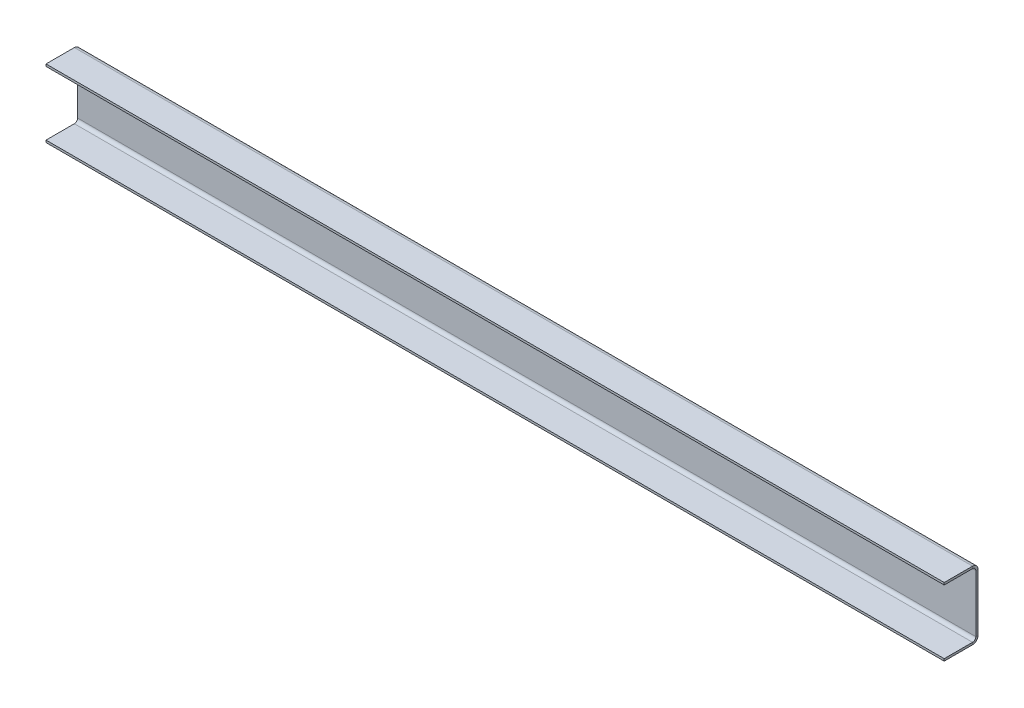
ISO-10303-21;
HEADER;
FILE_DESCRIPTION(('STEP AP214'),'2;1');
FILE_NAME('part.step','',(''),(''),'','','');
FILE_SCHEMA(('AUTOMOTIVE_DESIGN { 1 0 10303 214 1 1 1 1 }'));
ENDSEC;
DATA;
#1=APPLICATION_CONTEXT('core data for automotive mechanical design processes');
#2=APPLICATION_PROTOCOL_DEFINITION('international standard','automotive_design',2000,#1);
#3=PRODUCT_CONTEXT('',#1,'mechanical');
#4=PRODUCT('Part','Part','',(#3));
#5=PRODUCT_RELATED_PRODUCT_CATEGORY('part','',(#4));
#6=PRODUCT_DEFINITION_FORMATION('','',#4);
#7=PRODUCT_DEFINITION_CONTEXT('part definition',#1,'design');
#8=PRODUCT_DEFINITION('design','',#6,#7);
#9=PRODUCT_DEFINITION_SHAPE('','',#8);
#10=(LENGTH_UNIT() NAMED_UNIT(*) SI_UNIT(.MILLI.,.METRE.));
#11=(NAMED_UNIT(*) PLANE_ANGLE_UNIT() SI_UNIT($,.RADIAN.));
#12=(NAMED_UNIT(*) SI_UNIT($,.STERADIAN.) SOLID_ANGLE_UNIT());
#13=UNCERTAINTY_MEASURE_WITH_UNIT(LENGTH_MEASURE(1.E-05),#10,'distance_accuracy_value','');
#14=(GEOMETRIC_REPRESENTATION_CONTEXT(3) GLOBAL_UNCERTAINTY_ASSIGNED_CONTEXT((#13)) GLOBAL_UNIT_ASSIGNED_CONTEXT((#10,
#11,#12)) REPRESENTATION_CONTEXT('',''));
#15=CARTESIAN_POINT('',(0.,0.,0.));
#16=DIRECTION('',(0.,0.,1.));
#17=DIRECTION('',(1.,0.,0.));
#18=AXIS2_PLACEMENT_3D('',#15,#16,#17);
#19=CARTESIAN_POINT('',(0.,0.,-4.));
#20=DIRECTION('',(0.,0.,-1.));
#21=DIRECTION('',(-1.,0.,0.));
#22=AXIS2_PLACEMENT_3D('',#19,#20,#21);
#23=PLANE('',#22);
#24=DIRECTION('',(0.,1.,0.));
#25=VECTOR('',#24,1.);
#26=CARTESIAN_POINT('',(483.12769010043,106.886657101865,-4.));
#27=LINE('',#26,#25);
#28=CARTESIAN_POINT('',(483.12769010043,-8.11334289813497,-3.99999999999976));
#29=VERTEX_POINT('',#28);
#30=CARTESIAN_POINT('',(483.12769010043,96.8866571018649,-4.));
#31=VERTEX_POINT('',#30);
#32=EDGE_CURVE('E90',#29,#31,#27,.T.);
#33=ORIENTED_EDGE('',*,*,#32,.F.);
#34=DIRECTION('',(1.,0.,0.));
#35=VECTOR('',#34,1.);
#36=CARTESIAN_POINT('',(483.12769010043,-8.11334289813497,-3.99999999999976));
#37=LINE('',#36,#35);
#38=CARTESIAN_POINT('',(-1164.87230989957,-8.11334289813533,-4.));
#39=VERTEX_POINT('',#38);
#40=EDGE_CURVE('E280',#29,#39,#37,.F.);
#41=ORIENTED_EDGE('',*,*,#40,.T.);
#42=DIRECTION('',(0.,-1.,0.));
#43=VECTOR('',#42,1.);
#44=CARTESIAN_POINT('',(-1164.87230989957,106.886657101865,-4.));
#45=LINE('',#44,#43);
#46=CARTESIAN_POINT('',(-1164.87230989957,96.8866571018649,-4.00000000000002));
#47=VERTEX_POINT('',#46);
#48=EDGE_CURVE('E13',#47,#39,#45,.T.);
#49=ORIENTED_EDGE('',*,*,#48,.F.);
#50=DIRECTION('',(-1.,0.,0.));
#51=VECTOR('',#50,1.);
#52=CARTESIAN_POINT('',(-1164.87230989957,96.8866571018649,-4.00000000000002));
#53=LINE('',#52,#51);
#54=EDGE_CURVE('E105',#47,#31,#53,.F.);
#55=ORIENTED_EDGE('',*,*,#54,.T.);
#56=EDGE_LOOP('',(#33,#41,#49,#55));
#57=FACE_BOUND('',#56,.T.);
#58=ADVANCED_FACE('F81',(#57),#23,.T.);
#59=CARTESIAN_POINT('',(0.,0.,0.));
#60=DIRECTION('',(0.,0.,-1.));
#61=DIRECTION('',(-1.,0.,0.));
#62=AXIS2_PLACEMENT_3D('',#59,#60,#61);
#63=PLANE('',#62);
#64=DIRECTION('',(1.,0.,0.));
#65=VECTOR('',#64,1.);
#66=CARTESIAN_POINT('',(483.12769010043,-8.11334289813488,2.36789754470834E-13));
#67=LINE('',#66,#65);
#68=CARTESIAN_POINT('',(483.12769010043,-8.11334289813488,2.36789754470834E-13));
#69=VERTEX_POINT('',#68);
#70=CARTESIAN_POINT('',(-1164.87230989957,-8.11334289813536,1.17961196366423E-13));
#71=VERTEX_POINT('',#70);
#72=EDGE_CURVE('E197',#69,#71,#67,.F.);
#73=ORIENTED_EDGE('',*,*,#72,.F.);
#74=DIRECTION('',(0.,1.,0.));
#75=VECTOR('',#74,1.);
#76=CARTESIAN_POINT('',(483.12769010043,106.886657101865,0.));
#77=LINE('',#76,#75);
#78=CARTESIAN_POINT('',(483.12769010043,96.8866571018649,-1.37043154602168E-13));
#79=VERTEX_POINT('',#78);
#80=EDGE_CURVE('E186',#69,#79,#77,.T.);
#81=ORIENTED_EDGE('',*,*,#80,.T.);
#82=DIRECTION('',(-1.,0.,0.));
#83=VECTOR('',#82,1.);
#84=CARTESIAN_POINT('',(-1164.87230989957,96.8866571018649,0.));
#85=LINE('',#84,#83);
#86=CARTESIAN_POINT('',(-1164.87230989957,96.8866571018649,0.));
#87=VERTEX_POINT('',#86);
#88=EDGE_CURVE('E148',#87,#79,#85,.F.);
#89=ORIENTED_EDGE('',*,*,#88,.F.);
#90=DIRECTION('',(0.,-1.,0.));
#91=VECTOR('',#90,1.);
#92=CARTESIAN_POINT('',(-1164.87230989957,106.886657101865,0.));
#93=LINE('',#92,#91);
#94=EDGE_CURVE('E85',#87,#71,#93,.T.);
#95=ORIENTED_EDGE('',*,*,#94,.T.);
#96=EDGE_LOOP('',(#73,#81,#89,#95));
#97=FACE_BOUND('',#96,.T.);
#98=ADVANCED_FACE('F194',(#97),#63,.F.);
#99=CARTESIAN_POINT('',(483.12769010043,106.886657101865,-4.));
#100=DIRECTION('',(1.,0.,0.));
#101=DIRECTION('',(0.,0.,-1.));
#102=AXIS2_PLACEMENT_3D('',#99,#100,#101);
#103=PLANE('',#102);
#104=ORIENTED_EDGE('',*,*,#80,.F.);
#105=DIRECTION('',(0.,0.,-1.));
#106=VECTOR('',#105,1.);
#107=CARTESIAN_POINT('',(483.12769010043,-8.11334289813488,2.36789754470834E-13));
#108=LINE('',#107,#106);
#109=EDGE_CURVE('E210',#69,#29,#108,.T.);
#110=ORIENTED_EDGE('',*,*,#109,.T.);
#111=ORIENTED_EDGE('',*,*,#32,.T.);
#112=DIRECTION('',(0.,0.,-1.));
#113=VECTOR('',#112,1.);
#114=CARTESIAN_POINT('',(483.12769010043,96.8866571018649,-1.37043154602168E-13));
#115=LINE('',#114,#113);
#116=EDGE_CURVE('E183',#79,#31,#115,.T.);
#117=ORIENTED_EDGE('',*,*,#116,.F.);
#118=EDGE_LOOP('',(#104,#110,#111,#117));
#119=FACE_BOUND('',#118,.T.);
#120=ADVANCED_FACE('F83',(#119),#103,.T.);
#121=CARTESIAN_POINT('',(-1164.87230989957,106.886657101865,-4.));
#122=DIRECTION('',(-1.,0.,0.));
#123=DIRECTION('',(0.,0.,1.));
#124=AXIS2_PLACEMENT_3D('',#121,#122,#123);
#125=PLANE('',#124);
#126=DIRECTION('',(0.,0.,-1.));
#127=VECTOR('',#126,1.);
#128=CARTESIAN_POINT('',(-1164.87230989957,-8.11334289813536,1.17961196366423E-13));
#129=LINE('',#128,#127);
#130=EDGE_CURVE('E174',#71,#39,#129,.T.);
#131=ORIENTED_EDGE('',*,*,#130,.F.);
#132=ORIENTED_EDGE('',*,*,#94,.F.);
#133=DIRECTION('',(0.,0.,-1.));
#134=VECTOR('',#133,1.);
#135=CARTESIAN_POINT('',(-1164.87230989957,96.8866571018649,0.));
#136=LINE('',#135,#134);
#137=EDGE_CURVE('E147',#87,#47,#136,.T.);
#138=ORIENTED_EDGE('',*,*,#137,.T.);
#139=ORIENTED_EDGE('',*,*,#48,.T.);
#140=EDGE_LOOP('',(#131,#132,#138,#139));
#141=FACE_BOUND('',#140,.T.);
#142=ADVANCED_FACE('F202',(#141),#125,.T.);
#143=CARTESIAN_POINT('',(483.12769010043,96.886657101865,5.99999999999998));
#144=DIRECTION('',(1.,0.,0.));
#145=DIRECTION('',(0.,0.,-1.));
#146=AXIS2_PLACEMENT_3D('',#143,#144,#145);
#147=PLANE('',#146);
#148=DIRECTION('',(0.,1.,0.));
#149=VECTOR('',#148,1.);
#150=CARTESIAN_POINT('',(483.12769010043,106.886657101865,5.99999999999996));
#151=LINE('',#150,#149);
#152=CARTESIAN_POINT('',(483.12769010043,102.886657101865,5.99999999999996));
#153=VERTEX_POINT('',#152);
#154=CARTESIAN_POINT('',(483.12769010043,106.886657101865,5.99999999999995));
#155=VERTEX_POINT('',#154);
#156=EDGE_CURVE('E139',#153,#155,#151,.T.);
#157=ORIENTED_EDGE('',*,*,#156,.F.);
#158=CARTESIAN_POINT('',(483.12769010043,96.886657101865,5.99999999999998));
#159=DIRECTION('',(-1.,0.,0.));
#160=DIRECTION('',(0.,0.,1.));
#161=AXIS2_PLACEMENT_3D('',#158,#159,#160);
#162=CIRCLE('',#161,6.00000000000012);
#163=EDGE_CURVE('E133',#79,#153,#162,.F.);
#164=ORIENTED_EDGE('',*,*,#163,.F.);
#165=ORIENTED_EDGE('',*,*,#116,.T.);
#166=CARTESIAN_POINT('',(483.12769010043,96.886657101865,5.99999999999998));
#167=DIRECTION('',(-1.,0.,0.));
#168=DIRECTION('',(0.,0.,1.));
#169=AXIS2_PLACEMENT_3D('',#166,#167,#168);
#170=CIRCLE('',#169,10.0000000000001);
#171=EDGE_CURVE('E176',#31,#155,#170,.F.);
#172=ORIENTED_EDGE('',*,*,#171,.T.);
#173=EDGE_LOOP('',(#157,#164,#165,#172));
#174=FACE_BOUND('',#173,.T.);
#175=ADVANCED_FACE('F361',(#174),#147,.T.);
#176=CARTESIAN_POINT('',(-1164.87230989957,96.886657101865,6.0000000000001));
#177=DIRECTION('',(1.,0.,0.));
#178=DIRECTION('',(0.,0.,-1.));
#179=AXIS2_PLACEMENT_3D('',#176,#177,#178);
#180=PLANE('',#179);
#181=CARTESIAN_POINT('',(-1164.87230989957,96.886657101865,6.0000000000001));
#182=DIRECTION('',(-1.,0.,0.));
#183=DIRECTION('',(0.,0.,1.));
#184=AXIS2_PLACEMENT_3D('',#181,#182,#183);
#185=CIRCLE('',#184,6.00000000000012);
#186=CARTESIAN_POINT('',(-1164.87230989957,102.886657101865,6.00000000000008));
#187=VERTEX_POINT('',#186);
#188=EDGE_CURVE('E130',#187,#87,#185,.T.);
#189=ORIENTED_EDGE('',*,*,#188,.F.);
#190=DIRECTION('',(0.,1.,0.));
#191=VECTOR('',#190,1.);
#192=CARTESIAN_POINT('',(-1164.87230989957,102.886657101865,6.00000000000006));
#193=LINE('',#192,#191);
#194=CARTESIAN_POINT('',(-1164.87230989957,106.886657101865,6.00000000000005));
#195=VERTEX_POINT('',#194);
#196=EDGE_CURVE('E138',#187,#195,#193,.T.);
#197=ORIENTED_EDGE('',*,*,#196,.T.);
#198=CARTESIAN_POINT('',(-1164.87230989957,96.886657101865,6.0000000000001));
#199=DIRECTION('',(-1.,0.,0.));
#200=DIRECTION('',(0.,0.,1.));
#201=AXIS2_PLACEMENT_3D('',#198,#199,#200);
#202=CIRCLE('',#201,10.0000000000001);
#203=EDGE_CURVE('E177',#195,#47,#202,.T.);
#204=ORIENTED_EDGE('',*,*,#203,.T.);
#205=ORIENTED_EDGE('',*,*,#137,.F.);
#206=EDGE_LOOP('',(#189,#197,#204,#205));
#207=FACE_BOUND('',#206,.T.);
#208=ADVANCED_FACE('F143',(#207),#180,.F.);
#209=CARTESIAN_POINT('',(-1164.87230989957,96.886657101865,6.0000000000001));
#210=DIRECTION('',(-1.,0.,0.));
#211=DIRECTION('',(0.,1.,0.));
#212=AXIS2_PLACEMENT_3D('',#209,#210,#211);
#213=CYLINDRICAL_SURFACE('',#212,10.0000000000001);
#214=ORIENTED_EDGE('',*,*,#54,.F.);
#215=ORIENTED_EDGE('',*,*,#203,.F.);
#216=DIRECTION('',(-1.,0.,0.));
#217=VECTOR('',#216,1.);
#218=CARTESIAN_POINT('',(0.,106.886657101865,5.99999999999999));
#219=LINE('',#218,#217);
#220=EDGE_CURVE('E166',#155,#195,#219,.T.);
#221=ORIENTED_EDGE('',*,*,#220,.F.);
#222=ORIENTED_EDGE('',*,*,#171,.F.);
#223=EDGE_LOOP('',(#214,#215,#221,#222));
#224=FACE_BOUND('',#223,.T.);
#225=ADVANCED_FACE('F371',(#224),#213,.T.);
#226=CARTESIAN_POINT('',(-1164.87230989957,96.886657101865,6.0000000000001));
#227=DIRECTION('',(-1.,0.,0.));
#228=DIRECTION('',(0.,1.,0.));
#229=AXIS2_PLACEMENT_3D('',#226,#227,#228);
#230=CYLINDRICAL_SURFACE('',#229,6.00000000000012);
#231=ORIENTED_EDGE('',*,*,#88,.T.);
#232=ORIENTED_EDGE('',*,*,#163,.T.);
#233=DIRECTION('',(1.,0.,0.));
#234=VECTOR('',#233,1.);
#235=CARTESIAN_POINT('',(483.12769010043,102.886657101865,5.99999999999998));
#236=LINE('',#235,#234);
#237=EDGE_CURVE('E126',#153,#187,#236,.F.);
#238=ORIENTED_EDGE('',*,*,#237,.T.);
#239=ORIENTED_EDGE('',*,*,#188,.T.);
#240=EDGE_LOOP('',(#231,#232,#238,#239));
#241=FACE_BOUND('',#240,.T.);
#242=ADVANCED_FACE('F129',(#241),#230,.F.);
#243=CARTESIAN_POINT('',(-1164.87230989957,106.886657101865,0.));
#244=DIRECTION('',(-1.,0.,0.));
#245=DIRECTION('',(0.,-1.,0.));
#246=AXIS2_PLACEMENT_3D('',#243,#244,#245);
#247=PLANE('',#246);
#248=DIRECTION('',(0.,0.,-1.));
#249=VECTOR('',#248,1.);
#250=CARTESIAN_POINT('',(-1164.87230989957,106.886657101865,0.));
#251=LINE('',#250,#249);
#252=CARTESIAN_POINT('',(-1164.87230989957,106.886657101865,58.));
#253=VERTEX_POINT('',#252);
#254=EDGE_CURVE('E165',#253,#195,#251,.T.);
#255=ORIENTED_EDGE('',*,*,#254,.T.);
#256=ORIENTED_EDGE('',*,*,#196,.F.);
#257=DIRECTION('',(0.,0.,1.));
#258=VECTOR('',#257,1.);
#259=CARTESIAN_POINT('',(-1164.87230989957,102.886657101865,-3.58050083697384E-13));
#260=LINE('',#259,#258);
#261=CARTESIAN_POINT('',(-1164.87230989957,102.886657101865,58.));
#262=VERTEX_POINT('',#261);
#263=EDGE_CURVE('E153',#262,#187,#260,.F.);
#264=ORIENTED_EDGE('',*,*,#263,.F.);
#265=DIRECTION('',(0.,-1.,0.));
#266=VECTOR('',#265,1.);
#267=CARTESIAN_POINT('',(-1164.87230989957,106.886657101865,58.));
#268=LINE('',#267,#266);
#269=EDGE_CURVE('E149',#253,#262,#268,.T.);
#270=ORIENTED_EDGE('',*,*,#269,.F.);
#271=EDGE_LOOP('',(#255,#256,#264,#270));
#272=FACE_BOUND('',#271,.T.);
#273=ADVANCED_FACE('F163',(#272),#247,.T.);
#274=CARTESIAN_POINT('',(483.12769010043,106.886657101865,58.));
#275=DIRECTION('',(1.,0.,0.));
#276=DIRECTION('',(0.,1.,0.));
#277=AXIS2_PLACEMENT_3D('',#274,#275,#276);
#278=PLANE('',#277);
#279=DIRECTION('',(0.,0.,-1.));
#280=VECTOR('',#279,1.);
#281=CARTESIAN_POINT('',(483.12769010043,102.886657101865,-3.58050083697385E-13));
#282=LINE('',#281,#280);
#283=CARTESIAN_POINT('',(483.12769010043,102.886657101865,58.));
#284=VERTEX_POINT('',#283);
#285=EDGE_CURVE('E168',#153,#284,#282,.F.);
#286=ORIENTED_EDGE('',*,*,#285,.F.);
#287=ORIENTED_EDGE('',*,*,#156,.T.);
#288=DIRECTION('',(0.,0.,1.));
#289=VECTOR('',#288,1.);
#290=CARTESIAN_POINT('',(483.12769010043,106.886657101865,58.));
#291=LINE('',#290,#289);
#292=CARTESIAN_POINT('',(483.12769010043,106.886657101865,58.));
#293=VERTEX_POINT('',#292);
#294=EDGE_CURVE('E160',#155,#293,#291,.T.);
#295=ORIENTED_EDGE('',*,*,#294,.T.);
#296=DIRECTION('',(0.,-1.,0.));
#297=VECTOR('',#296,1.);
#298=CARTESIAN_POINT('',(483.12769010043,106.886657101865,58.));
#299=LINE('',#298,#297);
#300=EDGE_CURVE('E220',#293,#284,#299,.T.);
#301=ORIENTED_EDGE('',*,*,#300,.T.);
#302=EDGE_LOOP('',(#286,#287,#295,#301));
#303=FACE_BOUND('',#302,.T.);
#304=ADVANCED_FACE('F232',(#303),#278,.T.);
#305=CARTESIAN_POINT('',(0.,106.886657101865,-3.72016009052757E-13));
#306=DIRECTION('',(0.,1.,0.));
#307=DIRECTION('',(0.,0.,1.));
#308=AXIS2_PLACEMENT_3D('',#305,#306,#307);
#309=PLANE('',#308);
#310=ORIENTED_EDGE('',*,*,#294,.F.);
#311=ORIENTED_EDGE('',*,*,#220,.T.);
#312=ORIENTED_EDGE('',*,*,#254,.F.);
#313=DIRECTION('',(-1.,0.,0.));
#314=VECTOR('',#313,1.);
#315=CARTESIAN_POINT('',(-1164.87230989957,106.886657101865,58.));
#316=LINE('',#315,#314);
#317=EDGE_CURVE('E224',#293,#253,#316,.T.);
#318=ORIENTED_EDGE('',*,*,#317,.F.);
#319=EDGE_LOOP('',(#310,#311,#312,#318));
#320=FACE_BOUND('',#319,.T.);
#321=ADVANCED_FACE('F370',(#320),#309,.T.);
#322=CARTESIAN_POINT('',(0.,102.886657101865,-3.58050083697385E-13));
#323=DIRECTION('',(0.,1.,0.));
#324=DIRECTION('',(0.,0.,1.));
#325=AXIS2_PLACEMENT_3D('',#322,#323,#324);
#326=PLANE('',#325);
#327=ORIENTED_EDGE('',*,*,#237,.F.);
#328=ORIENTED_EDGE('',*,*,#285,.T.);
#329=DIRECTION('',(1.,0.,0.));
#330=VECTOR('',#329,1.);
#331=CARTESIAN_POINT('',(0.,102.886657101865,58.));
#332=LINE('',#331,#330);
#333=EDGE_CURVE('E157',#284,#262,#332,.F.);
#334=ORIENTED_EDGE('',*,*,#333,.T.);
#335=ORIENTED_EDGE('',*,*,#263,.T.);
#336=EDGE_LOOP('',(#327,#328,#334,#335));
#337=FACE_BOUND('',#336,.T.);
#338=ADVANCED_FACE('F154',(#337),#326,.F.);
#339=CARTESIAN_POINT('',(-1164.87230989957,106.886657101865,58.));
#340=DIRECTION('',(0.,0.,1.));
#341=DIRECTION('',(0.,-1.,0.));
#342=AXIS2_PLACEMENT_3D('',#339,#340,#341);
#343=PLANE('',#342);
#344=ORIENTED_EDGE('',*,*,#333,.F.);
#345=ORIENTED_EDGE('',*,*,#300,.F.);
#346=ORIENTED_EDGE('',*,*,#317,.T.);
#347=ORIENTED_EDGE('',*,*,#269,.T.);
#348=EDGE_LOOP('',(#344,#345,#346,#347));
#349=FACE_BOUND('',#348,.T.);
#350=ADVANCED_FACE('F237',(#349),#343,.T.);
#351=CARTESIAN_POINT('',(-1164.87230989957,-8.11334289813522,5.99999999999998));
#352=DIRECTION('',(-1.,0.,0.));
#353=DIRECTION('',(0.,-1.,0.));
#354=AXIS2_PLACEMENT_3D('',#351,#352,#353);
#355=PLANE('',#354);
#356=DIRECTION('',(0.,-1.,0.));
#357=VECTOR('',#356,1.);
#358=CARTESIAN_POINT('',(-1164.87230989957,-18.1133428981351,5.99999999999996));
#359=LINE('',#358,#357);
#360=CARTESIAN_POINT('',(-1164.87230989957,-14.1133428981351,5.99999999999996));
#361=VERTEX_POINT('',#360);
#362=CARTESIAN_POINT('',(-1164.87230989957,-18.1133428981351,5.99999999999995));
#363=VERTEX_POINT('',#362);
#364=EDGE_CURVE('E323',#361,#363,#359,.T.);
#365=ORIENTED_EDGE('',*,*,#364,.F.);
#366=CARTESIAN_POINT('',(-1164.87230989957,-8.11334289813522,5.99999999999998));
#367=DIRECTION('',(1.,0.,0.));
#368=DIRECTION('',(0.,1.,0.));
#369=AXIS2_PLACEMENT_3D('',#366,#367,#368);
#370=CIRCLE('',#369,5.99999999999986);
#371=EDGE_CURVE('E282',#71,#361,#370,.F.);
#372=ORIENTED_EDGE('',*,*,#371,.F.);
#373=ORIENTED_EDGE('',*,*,#130,.T.);
#374=CARTESIAN_POINT('',(-1164.87230989957,-8.11334289813522,5.99999999999998));
#375=DIRECTION('',(1.,0.,0.));
#376=DIRECTION('',(0.,1.,0.));
#377=AXIS2_PLACEMENT_3D('',#374,#375,#376);
#378=CIRCLE('',#377,9.99999999999986);
#379=EDGE_CURVE('E212',#39,#363,#378,.F.);
#380=ORIENTED_EDGE('',*,*,#379,.T.);
#381=EDGE_LOOP('',(#365,#372,#373,#380));
#382=FACE_BOUND('',#381,.T.);
#383=ADVANCED_FACE('F340',(#382),#355,.T.);
#384=CARTESIAN_POINT('',(483.12769010043,-8.11334289813475,6.0000000000001));
#385=DIRECTION('',(-1.,0.,0.));
#386=DIRECTION('',(0.,-1.,0.));
#387=AXIS2_PLACEMENT_3D('',#384,#385,#386);
#388=PLANE('',#387);
#389=CARTESIAN_POINT('',(483.12769010043,-8.11334289813475,6.0000000000001));
#390=DIRECTION('',(1.,0.,0.));
#391=DIRECTION('',(0.,1.,0.));
#392=AXIS2_PLACEMENT_3D('',#389,#390,#391);
#393=CIRCLE('',#392,5.99999999999986);
#394=CARTESIAN_POINT('',(483.12769010043,-14.1133428981346,6.00000000000008));
#395=VERTEX_POINT('',#394);
#396=EDGE_CURVE('E215',#395,#69,#393,.T.);
#397=ORIENTED_EDGE('',*,*,#396,.F.);
#398=DIRECTION('',(0.,-1.,0.));
#399=VECTOR('',#398,1.);
#400=CARTESIAN_POINT('',(483.12769010043,-14.1133428981349,6.00000000000006));
#401=LINE('',#400,#399);
#402=CARTESIAN_POINT('',(483.12769010043,-18.1133428981349,6.00000000000005));
#403=VERTEX_POINT('',#402);
#404=EDGE_CURVE('E286',#395,#403,#401,.T.);
#405=ORIENTED_EDGE('',*,*,#404,.T.);
#406=CARTESIAN_POINT('',(483.12769010043,-8.11334289813475,6.0000000000001));
#407=DIRECTION('',(1.,0.,0.));
#408=DIRECTION('',(0.,1.,0.));
#409=AXIS2_PLACEMENT_3D('',#406,#407,#408);
#410=CIRCLE('',#409,9.99999999999986);
#411=EDGE_CURVE('E275',#403,#29,#410,.T.);
#412=ORIENTED_EDGE('',*,*,#411,.T.);
#413=ORIENTED_EDGE('',*,*,#109,.F.);
#414=EDGE_LOOP('',(#397,#405,#412,#413));
#415=FACE_BOUND('',#414,.T.);
#416=ADVANCED_FACE('F287',(#415),#388,.F.);
#417=CARTESIAN_POINT('',(483.12769010043,-8.11334289813475,6.0000000000001));
#418=DIRECTION('',(1.,0.,0.));
#419=DIRECTION('',(0.,-1.,0.));
#420=AXIS2_PLACEMENT_3D('',#417,#418,#419);
#421=CYLINDRICAL_SURFACE('',#420,9.99999999999986);
#422=ORIENTED_EDGE('',*,*,#40,.F.);
#423=ORIENTED_EDGE('',*,*,#411,.F.);
#424=DIRECTION('',(1.,0.,0.));
#425=VECTOR('',#424,1.);
#426=CARTESIAN_POINT('',(0.,-18.1133428981349,6.00000000000002));
#427=LINE('',#426,#425);
#428=EDGE_CURVE('E279',#363,#403,#427,.T.);
#429=ORIENTED_EDGE('',*,*,#428,.F.);
#430=ORIENTED_EDGE('',*,*,#379,.F.);
#431=EDGE_LOOP('',(#422,#423,#429,#430));
#432=FACE_BOUND('',#431,.T.);
#433=ADVANCED_FACE('F277',(#432),#421,.T.);
#434=CARTESIAN_POINT('',(483.12769010043,-8.11334289813475,6.0000000000001));
#435=DIRECTION('',(1.,0.,0.));
#436=DIRECTION('',(0.,-1.,0.));
#437=AXIS2_PLACEMENT_3D('',#434,#435,#436);
#438=CYLINDRICAL_SURFACE('',#437,5.99999999999986);
#439=ORIENTED_EDGE('',*,*,#72,.T.);
#440=ORIENTED_EDGE('',*,*,#371,.T.);
#441=DIRECTION('',(-1.,0.,0.));
#442=VECTOR('',#441,1.);
#443=CARTESIAN_POINT('',(-1164.87230989957,-14.1133428981351,5.99999999999998));
#444=LINE('',#443,#442);
#445=EDGE_CURVE('E293',#361,#395,#444,.F.);
#446=ORIENTED_EDGE('',*,*,#445,.T.);
#447=ORIENTED_EDGE('',*,*,#396,.T.);
#448=EDGE_LOOP('',(#439,#440,#446,#447));
#449=FACE_BOUND('',#448,.T.);
#450=ADVANCED_FACE('F341',(#449),#438,.F.);
#451=CARTESIAN_POINT('',(483.12769010043,-18.1133428981349,0.));
#452=DIRECTION('',(1.,0.,0.));
#453=DIRECTION('',(0.,1.,0.));
#454=AXIS2_PLACEMENT_3D('',#451,#452,#453);
#455=PLANE('',#454);
#456=DIRECTION('',(0.,0.,-1.));
#457=VECTOR('',#456,1.);
#458=CARTESIAN_POINT('',(483.12769010043,-18.1133428981349,0.));
#459=LINE('',#458,#457);
#460=CARTESIAN_POINT('',(483.12769010043,-18.1133428981351,58.));
#461=VERTEX_POINT('',#460);
#462=EDGE_CURVE('E300',#461,#403,#459,.T.);
#463=ORIENTED_EDGE('',*,*,#462,.T.);
#464=ORIENTED_EDGE('',*,*,#404,.F.);
#465=DIRECTION('',(0.,0.,1.));
#466=VECTOR('',#465,1.);
#467=CARTESIAN_POINT('',(483.12769010043,-14.1133428981349,0.));
#468=LINE('',#467,#466);
#469=CARTESIAN_POINT('',(483.12769010043,-14.1133428981351,58.));
#470=VERTEX_POINT('',#469);
#471=EDGE_CURVE('E316',#470,#395,#468,.F.);
#472=ORIENTED_EDGE('',*,*,#471,.F.);
#473=DIRECTION('',(0.,1.,0.));
#474=VECTOR('',#473,1.);
#475=CARTESIAN_POINT('',(483.12769010043,-18.1133428981351,58.));
#476=LINE('',#475,#474);
#477=EDGE_CURVE('E305',#461,#470,#476,.T.);
#478=ORIENTED_EDGE('',*,*,#477,.F.);
#479=EDGE_LOOP('',(#463,#464,#472,#478));
#480=FACE_BOUND('',#479,.T.);
#481=ADVANCED_FACE('F304',(#480),#455,.T.);
#482=CARTESIAN_POINT('',(-1164.87230989957,-18.1133428981353,58.));
#483=DIRECTION('',(-1.,0.,0.));
#484=DIRECTION('',(0.,-1.,0.));
#485=AXIS2_PLACEMENT_3D('',#482,#483,#484);
#486=PLANE('',#485);
#487=DIRECTION('',(0.,0.,-1.));
#488=VECTOR('',#487,1.);
#489=CARTESIAN_POINT('',(-1164.87230989957,-14.1133428981351,0.));
#490=LINE('',#489,#488);
#491=CARTESIAN_POINT('',(-1164.87230989957,-14.1133428981353,58.));
#492=VERTEX_POINT('',#491);
#493=EDGE_CURVE('E302',#361,#492,#490,.F.);
#494=ORIENTED_EDGE('',*,*,#493,.F.);
#495=ORIENTED_EDGE('',*,*,#364,.T.);
#496=DIRECTION('',(0.,0.,1.));
#497=VECTOR('',#496,1.);
#498=CARTESIAN_POINT('',(-1164.87230989957,-18.1133428981353,58.));
#499=LINE('',#498,#497);
#500=CARTESIAN_POINT('',(-1164.87230989957,-18.1133428981353,58.));
#501=VERTEX_POINT('',#500);
#502=EDGE_CURVE('E301',#363,#501,#499,.T.);
#503=ORIENTED_EDGE('',*,*,#502,.T.);
#504=DIRECTION('',(0.,1.,0.));
#505=VECTOR('',#504,1.);
#506=CARTESIAN_POINT('',(-1164.87230989957,-18.1133428981353,58.));
#507=LINE('',#506,#505);
#508=EDGE_CURVE('E307',#501,#492,#507,.T.);
#509=ORIENTED_EDGE('',*,*,#508,.T.);
#510=EDGE_LOOP('',(#494,#495,#503,#509));
#511=FACE_BOUND('',#510,.T.);
#512=ADVANCED_FACE('F339',(#511),#486,.T.);
#513=CARTESIAN_POINT('',(0.,-18.1133428981349,0.));
#514=DIRECTION('',(0.,-1.,0.));
#515=DIRECTION('',(0.,0.,-1.));
#516=AXIS2_PLACEMENT_3D('',#513,#514,#515);
#517=PLANE('',#516);
#518=ORIENTED_EDGE('',*,*,#502,.F.);
#519=ORIENTED_EDGE('',*,*,#428,.T.);
#520=ORIENTED_EDGE('',*,*,#462,.F.);
#521=DIRECTION('',(1.,0.,0.));
#522=VECTOR('',#521,1.);
#523=CARTESIAN_POINT('',(483.12769010043,-18.1133428981351,58.));
#524=LINE('',#523,#522);
#525=EDGE_CURVE('E308',#501,#461,#524,.T.);
#526=ORIENTED_EDGE('',*,*,#525,.F.);
#527=EDGE_LOOP('',(#518,#519,#520,#526));
#528=FACE_BOUND('',#527,.T.);
#529=ADVANCED_FACE('F298',(#528),#517,.T.);
#530=CARTESIAN_POINT('',(0.,-14.1133428981349,0.));
#531=DIRECTION('',(0.,-1.,0.));
#532=DIRECTION('',(0.,0.,-1.));
#533=AXIS2_PLACEMENT_3D('',#530,#531,#532);
#534=PLANE('',#533);
#535=ORIENTED_EDGE('',*,*,#445,.F.);
#536=ORIENTED_EDGE('',*,*,#493,.T.);
#537=DIRECTION('',(-1.,0.,0.));
#538=VECTOR('',#537,1.);
#539=CARTESIAN_POINT('',(0.,-14.1133428981351,58.));
#540=LINE('',#539,#538);
#541=EDGE_CURVE('E318',#492,#470,#540,.F.);
#542=ORIENTED_EDGE('',*,*,#541,.T.);
#543=ORIENTED_EDGE('',*,*,#471,.T.);
#544=EDGE_LOOP('',(#535,#536,#542,#543));
#545=FACE_BOUND('',#544,.T.);
#546=ADVANCED_FACE('F336',(#545),#534,.F.);
#547=CARTESIAN_POINT('',(483.12769010043,-18.1133428981351,58.));
#548=DIRECTION('',(0.,0.,1.));
#549=DIRECTION('',(0.,-1.,0.));
#550=AXIS2_PLACEMENT_3D('',#547,#548,#549);
#551=PLANE('',#550);
#552=ORIENTED_EDGE('',*,*,#541,.F.);
#553=ORIENTED_EDGE('',*,*,#508,.F.);
#554=ORIENTED_EDGE('',*,*,#525,.T.);
#555=ORIENTED_EDGE('',*,*,#477,.T.);
#556=EDGE_LOOP('',(#552,#553,#554,#555));
#557=FACE_BOUND('',#556,.T.);
#558=ADVANCED_FACE('F332',(#557),#551,.T.);
#559=CLOSED_SHELL('',(#58,#98,#120,#142,#175,#208,#225,#242,#273,#304,#321,#338,#350,#383,#416,
#433,#450,#481,#512,#529,#546,#558));
#560=MANIFOLD_SOLID_BREP('B2',#559);
#561=ADVANCED_BREP_SHAPE_REPRESENTATION('',(#18,#560),#14);
#562=SHAPE_DEFINITION_REPRESENTATION(#9,#561);
ENDSEC;
END-ISO-10303-21;
